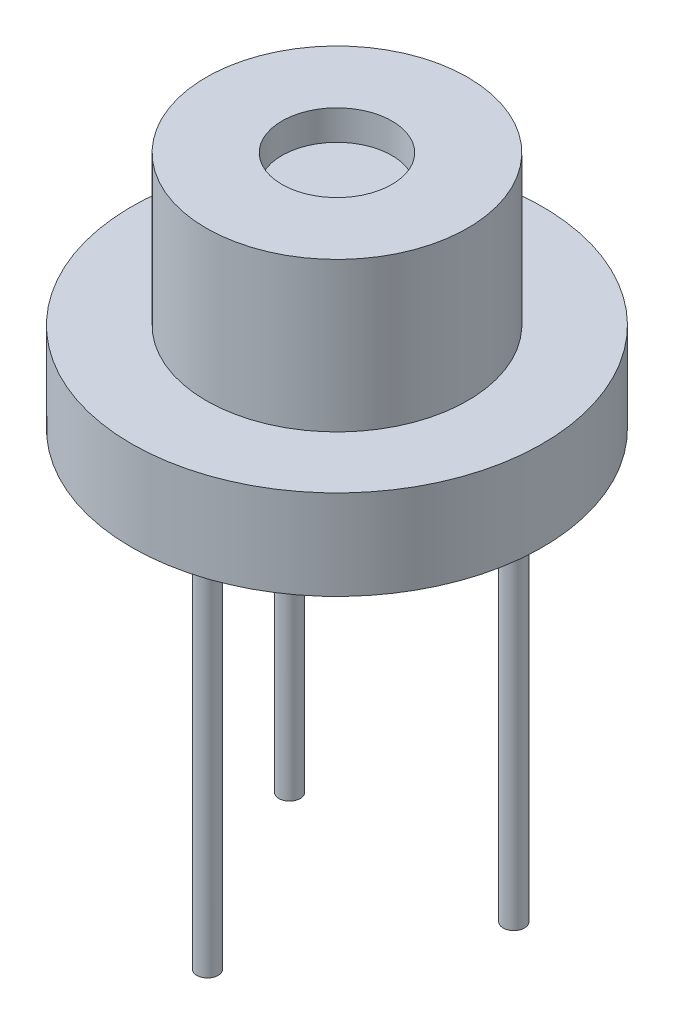
ISO-10303-21;
HEADER;
FILE_DESCRIPTION(('STEP AP214'),'2;1');
FILE_NAME('part.step','',(''),(''),'','','');
FILE_SCHEMA(('AUTOMOTIVE_DESIGN { 1 0 10303 214 1 1 1 1 }'));
ENDSEC;
DATA;
#1=APPLICATION_CONTEXT('core data for automotive mechanical design processes');
#2=APPLICATION_PROTOCOL_DEFINITION('international standard','automotive_design',2000,#1);
#3=PRODUCT_CONTEXT('',#1,'mechanical');
#4=PRODUCT('Part','Part','',(#3));
#5=PRODUCT_RELATED_PRODUCT_CATEGORY('part','',(#4));
#6=PRODUCT_DEFINITION_FORMATION('','',#4);
#7=PRODUCT_DEFINITION_CONTEXT('part definition',#1,'design');
#8=PRODUCT_DEFINITION('design','',#6,#7);
#9=PRODUCT_DEFINITION_SHAPE('','',#8);
#10=(LENGTH_UNIT() NAMED_UNIT(*) SI_UNIT(.MILLI.,.METRE.));
#11=(NAMED_UNIT(*) PLANE_ANGLE_UNIT() SI_UNIT($,.RADIAN.));
#12=(NAMED_UNIT(*) SI_UNIT($,.STERADIAN.) SOLID_ANGLE_UNIT());
#13=UNCERTAINTY_MEASURE_WITH_UNIT(LENGTH_MEASURE(1.E-05),#10,'distance_accuracy_value','');
#14=(GEOMETRIC_REPRESENTATION_CONTEXT(3) GLOBAL_UNCERTAINTY_ASSIGNED_CONTEXT((#13)) GLOBAL_UNIT_ASSIGNED_CONTEXT((#10,
#11,#12)) REPRESENTATION_CONTEXT('',''));
#15=CARTESIAN_POINT('',(0.,0.,0.));
#16=DIRECTION('',(0.,0.,1.));
#17=DIRECTION('',(1.,0.,0.));
#18=AXIS2_PLACEMENT_3D('',#15,#16,#17);
#19=CARTESIAN_POINT('',(0.,1.2,0.));
#20=DIRECTION('',(0.,-1.,0.));
#21=DIRECTION('',(0.,0.,-1.));
#22=AXIS2_PLACEMENT_3D('',#19,#20,#21);
#23=CYLINDRICAL_SURFACE('',#22,2.75);
#24=CARTESIAN_POINT('',(0.,1.2,0.));
#25=DIRECTION('',(0.,1.,0.));
#26=DIRECTION('',(0.,0.,1.));
#27=AXIS2_PLACEMENT_3D('',#24,#25,#26);
#28=CIRCLE('',#27,2.75);
#29=CARTESIAN_POINT('',(0.,1.2,2.75));
#30=VERTEX_POINT('',#29);
#31=EDGE_CURVE('E47',#30,#30,#28,.T.);
#32=ORIENTED_EDGE('',*,*,#31,.F.);
#33=EDGE_LOOP('',(#32));
#34=FACE_BOUND('',#33,.T.);
#35=CARTESIAN_POINT('',(0.,0.,0.));
#36=DIRECTION('',(0.,1.,0.));
#37=DIRECTION('',(0.,0.,1.));
#38=AXIS2_PLACEMENT_3D('',#35,#36,#37);
#39=CIRCLE('',#38,2.75);
#40=CARTESIAN_POINT('',(0.,0.,2.75));
#41=VERTEX_POINT('',#40);
#42=EDGE_CURVE('E50',#41,#41,#39,.T.);
#43=ORIENTED_EDGE('',*,*,#42,.T.);
#44=EDGE_LOOP('',(#43));
#45=FACE_BOUND('',#44,.T.);
#46=ADVANCED_FACE('F33',(#34,#45),#23,.T.);
#47=CARTESIAN_POINT('',(0.,1.2,0.));
#48=DIRECTION('',(0.,1.,0.));
#49=DIRECTION('',(0.,0.,1.));
#50=AXIS2_PLACEMENT_3D('',#47,#48,#49);
#51=PLANE('',#50);
#52=CARTESIAN_POINT('',(0.,1.2,0.));
#53=DIRECTION('',(0.,1.,0.));
#54=DIRECTION('',(0.,0.,1.));
#55=AXIS2_PLACEMENT_3D('',#52,#53,#54);
#56=CIRCLE('',#55,1.75);
#57=CARTESIAN_POINT('',(0.,1.2,1.75));
#58=VERTEX_POINT('',#57);
#59=EDGE_CURVE('E56',#58,#58,#56,.T.);
#60=ORIENTED_EDGE('',*,*,#59,.F.);
#61=EDGE_LOOP('',(#60));
#62=FACE_BOUND('',#61,.T.);
#63=ORIENTED_EDGE('',*,*,#31,.T.);
#64=EDGE_LOOP('',(#63));
#65=FACE_BOUND('',#64,.T.);
#66=ADVANCED_FACE('F92',(#62,#65),#51,.T.);
#67=CARTESIAN_POINT('',(0.,0.,0.));
#68=DIRECTION('',(0.,1.,0.));
#69=DIRECTION('',(0.,0.,1.));
#70=AXIS2_PLACEMENT_3D('',#67,#68,#69);
#71=PLANE('',#70);
#72=CARTESIAN_POINT('',(-1.50106143091817,0.,-0.86663822121076));
#73=DIRECTION('',(0.,1.,0.));
#74=DIRECTION('',(0.,0.,1.));
#75=AXIS2_PLACEMENT_3D('',#72,#73,#74);
#76=CIRCLE('',#75,0.143122076625375);
#77=CARTESIAN_POINT('',(-1.50106143091817,0.,-0.723516144585385));
#78=VERTEX_POINT('',#77);
#79=EDGE_CURVE('E10',#78,#78,#76,.F.);
#80=ORIENTED_EDGE('',*,*,#79,.F.);
#81=EDGE_LOOP('',(#80));
#82=FACE_BOUND('',#81,.T.);
#83=CARTESIAN_POINT('',(1.50106143091827,0.,-0.866638221210839));
#84=DIRECTION('',(0.,1.,0.));
#85=DIRECTION('',(0.,0.,1.));
#86=AXIS2_PLACEMENT_3D('',#83,#84,#85);
#87=CIRCLE('',#86,0.143122076625331);
#88=CARTESIAN_POINT('',(1.50106143091827,0.,-0.723516144585508));
#89=VERTEX_POINT('',#88);
#90=EDGE_CURVE('E39',#89,#89,#87,.F.);
#91=ORIENTED_EDGE('',*,*,#90,.F.);
#92=EDGE_LOOP('',(#91));
#93=FACE_BOUND('',#92,.T.);
#94=CARTESIAN_POINT('',(1.20121251647152E-13,0.,1.7332764424216));
#95=DIRECTION('',(0.,1.,0.));
#96=DIRECTION('',(0.,0.,1.));
#97=AXIS2_PLACEMENT_3D('',#94,#95,#96);
#98=CIRCLE('',#97,0.143122076625235);
#99=CARTESIAN_POINT('',(1.20121251647152E-13,0.,1.87639851904683));
#100=VERTEX_POINT('',#99);
#101=EDGE_CURVE('E43',#100,#100,#98,.F.);
#102=ORIENTED_EDGE('',*,*,#101,.F.);
#103=EDGE_LOOP('',(#102));
#104=FACE_BOUND('',#103,.T.);
#105=ORIENTED_EDGE('',*,*,#42,.F.);
#106=EDGE_LOOP('',(#105));
#107=FACE_BOUND('',#106,.T.);
#108=ADVANCED_FACE('F97',(#82,#93,#104,#107),#71,.F.);
#109=CARTESIAN_POINT('',(0.,3.2,0.));
#110=DIRECTION('',(0.,-1.,0.));
#111=DIRECTION('',(0.,0.,-1.));
#112=AXIS2_PLACEMENT_3D('',#109,#110,#111);
#113=CYLINDRICAL_SURFACE('',#112,1.75);
#114=CARTESIAN_POINT('',(0.,3.2,0.));
#115=DIRECTION('',(0.,1.,0.));
#116=DIRECTION('',(0.,0.,1.));
#117=AXIS2_PLACEMENT_3D('',#114,#115,#116);
#118=CIRCLE('',#117,1.75);
#119=CARTESIAN_POINT('',(0.,3.2,1.75));
#120=VERTEX_POINT('',#119);
#121=EDGE_CURVE('E53',#120,#120,#118,.T.);
#122=ORIENTED_EDGE('',*,*,#121,.F.);
#123=EDGE_LOOP('',(#122));
#124=FACE_BOUND('',#123,.T.);
#125=ORIENTED_EDGE('',*,*,#59,.T.);
#126=EDGE_LOOP('',(#125));
#127=FACE_BOUND('',#126,.T.);
#128=ADVANCED_FACE('F105',(#124,#127),#113,.T.);
#129=CARTESIAN_POINT('',(0.,3.2,0.));
#130=DIRECTION('',(0.,1.,0.));
#131=DIRECTION('',(0.,0.,1.));
#132=AXIS2_PLACEMENT_3D('',#129,#130,#131);
#133=PLANE('',#132);
#134=CARTESIAN_POINT('',(0.,3.2,0.));
#135=DIRECTION('',(0.,1.,0.));
#136=DIRECTION('',(0.,0.,1.));
#137=AXIS2_PLACEMENT_3D('',#134,#135,#136);
#138=CIRCLE('',#137,0.736254348389562);
#139=CARTESIAN_POINT('',(0.,3.2,0.736254348389562));
#140=VERTEX_POINT('',#139);
#141=EDGE_CURVE('E62',#140,#140,#138,.T.);
#142=ORIENTED_EDGE('',*,*,#141,.F.);
#143=EDGE_LOOP('',(#142));
#144=FACE_BOUND('',#143,.T.);
#145=ORIENTED_EDGE('',*,*,#121,.T.);
#146=EDGE_LOOP('',(#145));
#147=FACE_BOUND('',#146,.T.);
#148=ADVANCED_FACE('F112',(#144,#147),#133,.T.);
#149=CARTESIAN_POINT('',(0.,2.8,0.));
#150=DIRECTION('',(0.,1.,0.));
#151=DIRECTION('',(0.,0.,1.));
#152=AXIS2_PLACEMENT_3D('',#149,#150,#151);
#153=CYLINDRICAL_SURFACE('',#152,0.736254348389562);
#154=CARTESIAN_POINT('',(0.,2.8,0.));
#155=DIRECTION('',(0.,1.,0.));
#156=DIRECTION('',(0.,0.,1.));
#157=AXIS2_PLACEMENT_3D('',#154,#155,#156);
#158=CIRCLE('',#157,0.736254348389562);
#159=CARTESIAN_POINT('',(0.,2.8,0.736254348389562));
#160=VERTEX_POINT('',#159);
#161=EDGE_CURVE('E59',#160,#160,#158,.T.);
#162=ORIENTED_EDGE('',*,*,#161,.F.);
#163=EDGE_LOOP('',(#162));
#164=FACE_BOUND('',#163,.T.);
#165=ORIENTED_EDGE('',*,*,#141,.T.);
#166=EDGE_LOOP('',(#165));
#167=FACE_BOUND('',#166,.T.);
#168=ADVANCED_FACE('F119',(#164,#167),#153,.F.);
#169=CARTESIAN_POINT('',(0.,2.8,0.));
#170=DIRECTION('',(0.,1.,0.));
#171=DIRECTION('',(0.,0.,1.));
#172=AXIS2_PLACEMENT_3D('',#169,#170,#171);
#173=PLANE('',#172);
#174=ORIENTED_EDGE('',*,*,#161,.T.);
#175=EDGE_LOOP('',(#174));
#176=FACE_BOUND('',#175,.T.);
#177=ADVANCED_FACE('F123',(#176),#173,.T.);
#178=CARTESIAN_POINT('',(1.20121251647152E-13,-5.4,1.7332764424216));
#179=DIRECTION('',(0.,1.,0.));
#180=DIRECTION('',(0.,0.,1.));
#181=AXIS2_PLACEMENT_3D('',#178,#179,#180);
#182=CYLINDRICAL_SURFACE('',#181,0.143122076625235);
#183=CARTESIAN_POINT('',(1.20121251647152E-13,-5.4,1.7332764424216));
#184=DIRECTION('',(0.,-1.,0.));
#185=DIRECTION('',(0.,0.,-1.));
#186=AXIS2_PLACEMENT_3D('',#183,#184,#185);
#187=CIRCLE('',#186,0.143122076625235);
#188=CARTESIAN_POINT('',(1.20121251647152E-13,-5.4,1.59015436579637));
#189=VERTEX_POINT('',#188);
#190=EDGE_CURVE('E65',#189,#189,#187,.T.);
#191=ORIENTED_EDGE('',*,*,#190,.F.);
#192=EDGE_LOOP('',(#191));
#193=FACE_BOUND('',#192,.T.);
#194=ORIENTED_EDGE('',*,*,#101,.T.);
#195=EDGE_LOOP('',(#194));
#196=FACE_BOUND('',#195,.T.);
#197=ADVANCED_FACE('F127',(#193,#196),#182,.T.);
#198=CARTESIAN_POINT('',(1.20121251647152E-13,-5.4,1.7332764424216));
#199=DIRECTION('',(0.,-1.,0.));
#200=DIRECTION('',(0.,0.,-1.));
#201=AXIS2_PLACEMENT_3D('',#198,#199,#200);
#202=PLANE('',#201);
#203=ORIENTED_EDGE('',*,*,#190,.T.);
#204=EDGE_LOOP('',(#203));
#205=FACE_BOUND('',#204,.T.);
#206=ADVANCED_FACE('F131',(#205),#202,.T.);
#207=CARTESIAN_POINT('',(1.50106143091827,-5.4,-0.866638221210839));
#208=DIRECTION('',(0.,1.,0.));
#209=DIRECTION('',(0.,0.,1.));
#210=AXIS2_PLACEMENT_3D('',#207,#208,#209);
#211=CYLINDRICAL_SURFACE('',#210,0.143122076625331);
#212=CARTESIAN_POINT('',(1.50106143091827,-5.4,-0.866638221210839));
#213=DIRECTION('',(0.,-1.,0.));
#214=DIRECTION('',(0.,0.,-1.));
#215=AXIS2_PLACEMENT_3D('',#212,#213,#214);
#216=CIRCLE('',#215,0.143122076625331);
#217=CARTESIAN_POINT('',(1.50106143091827,-5.4,-1.00976029783617));
#218=VERTEX_POINT('',#217);
#219=EDGE_CURVE('E70',#218,#218,#216,.T.);
#220=ORIENTED_EDGE('',*,*,#219,.F.);
#221=EDGE_LOOP('',(#220));
#222=FACE_BOUND('',#221,.T.);
#223=ORIENTED_EDGE('',*,*,#90,.T.);
#224=EDGE_LOOP('',(#223));
#225=FACE_BOUND('',#224,.T.);
#226=ADVANCED_FACE('F88',(#222,#225),#211,.T.);
#227=CARTESIAN_POINT('',(1.50106143091827,-5.4,-0.866638221210839));
#228=DIRECTION('',(0.,-1.,0.));
#229=DIRECTION('',(0.,0.,-1.));
#230=AXIS2_PLACEMENT_3D('',#227,#228,#229);
#231=PLANE('',#230);
#232=ORIENTED_EDGE('',*,*,#219,.T.);
#233=EDGE_LOOP('',(#232));
#234=FACE_BOUND('',#233,.T.);
#235=ADVANCED_FACE('F81',(#234),#231,.T.);
#236=CARTESIAN_POINT('',(-1.50106143091817,-5.4,-0.86663822121076));
#237=DIRECTION('',(0.,1.,0.));
#238=DIRECTION('',(0.,0.,1.));
#239=AXIS2_PLACEMENT_3D('',#236,#237,#238);
#240=CYLINDRICAL_SURFACE('',#239,0.143122076625375);
#241=CARTESIAN_POINT('',(-1.50106143091817,-5.4,-0.86663822121076));
#242=DIRECTION('',(0.,-1.,0.));
#243=DIRECTION('',(0.,0.,-1.));
#244=AXIS2_PLACEMENT_3D('',#241,#242,#243);
#245=CIRCLE('',#244,0.143122076625375);
#246=CARTESIAN_POINT('',(-1.50106143091817,-5.4,-1.00976029783614));
#247=VERTEX_POINT('',#246);
#248=EDGE_CURVE('E73',#247,#247,#245,.T.);
#249=ORIENTED_EDGE('',*,*,#248,.F.);
#250=EDGE_LOOP('',(#249));
#251=FACE_BOUND('',#250,.T.);
#252=ORIENTED_EDGE('',*,*,#79,.T.);
#253=EDGE_LOOP('',(#252));
#254=FACE_BOUND('',#253,.T.);
#255=ADVANCED_FACE('F79',(#251,#254),#240,.T.);
#256=CARTESIAN_POINT('',(-1.50106143091817,-5.4,-0.86663822121076));
#257=DIRECTION('',(0.,-1.,0.));
#258=DIRECTION('',(0.,0.,-1.));
#259=AXIS2_PLACEMENT_3D('',#256,#257,#258);
#260=PLANE('',#259);
#261=ORIENTED_EDGE('',*,*,#248,.T.);
#262=EDGE_LOOP('',(#261));
#263=FACE_BOUND('',#262,.T.);
#264=ADVANCED_FACE('F77',(#263),#260,.T.);
#265=CLOSED_SHELL('',(#46,#66,#108,#128,#148,#168,#177,#197,#206,#226,#235,#255,#264));
#266=MANIFOLD_SOLID_BREP('B2',#265);
#267=ADVANCED_BREP_SHAPE_REPRESENTATION('',(#18,#266),#14);
#268=SHAPE_DEFINITION_REPRESENTATION(#9,#267);
ENDSEC;
END-ISO-10303-21;
